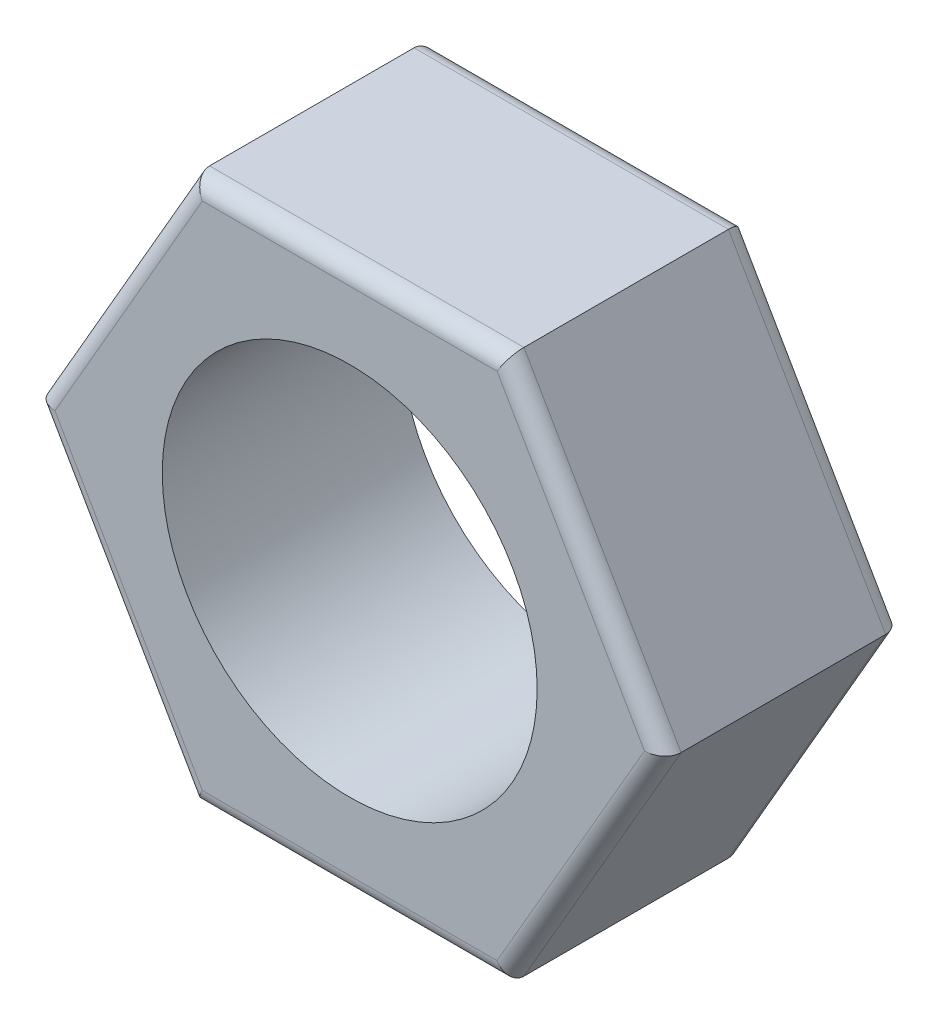
ISO-10303-21;
HEADER;
FILE_DESCRIPTION(('STEP AP214'),'2;1');
FILE_NAME('part.step','',(''),(''),'','','');
FILE_SCHEMA(('AUTOMOTIVE_DESIGN { 1 0 10303 214 1 1 1 1 }'));
ENDSEC;
DATA;
#1=APPLICATION_CONTEXT('core data for automotive mechanical design processes');
#2=APPLICATION_PROTOCOL_DEFINITION('international standard','automotive_design',2000,#1);
#3=PRODUCT_CONTEXT('',#1,'mechanical');
#4=PRODUCT('Part','Part','',(#3));
#5=PRODUCT_RELATED_PRODUCT_CATEGORY('part','',(#4));
#6=PRODUCT_DEFINITION_FORMATION('','',#4);
#7=PRODUCT_DEFINITION_CONTEXT('part definition',#1,'design');
#8=PRODUCT_DEFINITION('design','',#6,#7);
#9=PRODUCT_DEFINITION_SHAPE('','',#8);
#10=(LENGTH_UNIT() NAMED_UNIT(*) SI_UNIT(.MILLI.,.METRE.));
#11=(NAMED_UNIT(*) PLANE_ANGLE_UNIT() SI_UNIT($,.RADIAN.));
#12=(NAMED_UNIT(*) SI_UNIT($,.STERADIAN.) SOLID_ANGLE_UNIT());
#13=UNCERTAINTY_MEASURE_WITH_UNIT(LENGTH_MEASURE(1.E-05),#10,'distance_accuracy_value','');
#14=(GEOMETRIC_REPRESENTATION_CONTEXT(3) GLOBAL_UNCERTAINTY_ASSIGNED_CONTEXT((#13)) GLOBAL_UNIT_ASSIGNED_CONTEXT((#10,
#11,#12)) REPRESENTATION_CONTEXT('',''));
#15=CARTESIAN_POINT('',(0.,0.,0.));
#16=DIRECTION('',(0.,0.,1.));
#17=DIRECTION('',(1.,0.,0.));
#18=AXIS2_PLACEMENT_3D('',#15,#16,#17);
#19=CARTESIAN_POINT('',(-9.225,-15.9781686998229,14.));
#20=DIRECTION('',(0.,1.,0.));
#21=DIRECTION('',(0.,0.,1.));
#22=AXIS2_PLACEMENT_3D('',#19,#20,#21);
#23=PLANE('',#22);
#24=DIRECTION('',(0.,0.,-1.));
#25=VECTOR('',#24,1.);
#26=CARTESIAN_POINT('',(9.225,-15.9781686998229,14.));
#27=LINE('',#26,#25);
#28=CARTESIAN_POINT('',(9.225,-15.9781686998229,13.));
#29=VERTEX_POINT('',#28);
#30=CARTESIAN_POINT('',(9.225,-15.9781686998229,0.999999999999999));
#31=VERTEX_POINT('',#30);
#32=EDGE_CURVE('E149',#29,#31,#27,.T.);
#33=ORIENTED_EDGE('',*,*,#32,.F.);
#34=DIRECTION('',(1.,0.,0.));
#35=VECTOR('',#34,1.);
#36=CARTESIAN_POINT('',(-9.225,-15.9781686998229,13.));
#37=LINE('',#36,#35);
#38=CARTESIAN_POINT('',(-9.225,-15.9781686998229,13.));
#39=VERTEX_POINT('',#38);
#40=EDGE_CURVE('E209',#29,#39,#37,.F.);
#41=ORIENTED_EDGE('',*,*,#40,.T.);
#42=DIRECTION('',(0.,0.,-1.));
#43=VECTOR('',#42,1.);
#44=CARTESIAN_POINT('',(-9.225,-15.9781686998229,14.));
#45=LINE('',#44,#43);
#46=CARTESIAN_POINT('',(-9.225,-15.9781686998229,0.999999999999999));
#47=VERTEX_POINT('',#46);
#48=EDGE_CURVE('E260',#39,#47,#45,.T.);
#49=ORIENTED_EDGE('',*,*,#48,.T.);
#50=DIRECTION('',(1.,0.,0.));
#51=VECTOR('',#50,1.);
#52=CARTESIAN_POINT('',(-9.225,-15.9781686998229,0.999999999999999));
#53=LINE('',#52,#51);
#54=EDGE_CURVE('E207',#47,#31,#53,.T.);
#55=ORIENTED_EDGE('',*,*,#54,.T.);
#56=EDGE_LOOP('',(#33,#41,#49,#55));
#57=FACE_BOUND('',#56,.T.);
#58=ADVANCED_FACE('F36',(#57),#23,.F.);
#59=CARTESIAN_POINT('',(9.225,-15.9781686998229,14.));
#60=DIRECTION('',(-0.866025403784439,0.5,0.));
#61=DIRECTION('',(-0.5,-0.866025403784439,0.));
#62=AXIS2_PLACEMENT_3D('',#59,#60,#61);
#63=PLANE('',#62);
#64=DIRECTION('',(0.,0.,-1.));
#65=VECTOR('',#64,1.);
#66=CARTESIAN_POINT('',(18.45,0.,14.));
#67=LINE('',#66,#65);
#68=CARTESIAN_POINT('',(18.45,0.,13.));
#69=VERTEX_POINT('',#68);
#70=CARTESIAN_POINT('',(18.45,0.,0.999999999999999));
#71=VERTEX_POINT('',#70);
#72=EDGE_CURVE('E270',#69,#71,#67,.T.);
#73=ORIENTED_EDGE('',*,*,#72,.F.);
#74=DIRECTION('',(0.5,0.866025403784439,0.));
#75=VECTOR('',#74,1.);
#76=CARTESIAN_POINT('',(9.225,-15.9781686998229,13.));
#77=LINE('',#76,#75);
#78=EDGE_CURVE('E202',#69,#29,#77,.F.);
#79=ORIENTED_EDGE('',*,*,#78,.T.);
#80=ORIENTED_EDGE('',*,*,#32,.T.);
#81=DIRECTION('',(0.5,0.866025403784439,0.));
#82=VECTOR('',#81,1.);
#83=CARTESIAN_POINT('',(9.225,-15.9781686998229,0.999999999999999));
#84=LINE('',#83,#82);
#85=EDGE_CURVE('E232',#31,#71,#84,.T.);
#86=ORIENTED_EDGE('',*,*,#85,.T.);
#87=EDGE_LOOP('',(#73,#79,#80,#86));
#88=FACE_BOUND('',#87,.T.);
#89=ADVANCED_FACE('F282',(#88),#63,.F.);
#90=CARTESIAN_POINT('',(18.45,0.,14.));
#91=DIRECTION('',(-0.866025403784439,-0.5,0.));
#92=DIRECTION('',(0.5,-0.866025403784439,0.));
#93=AXIS2_PLACEMENT_3D('',#90,#91,#92);
#94=PLANE('',#93);
#95=DIRECTION('',(0.,0.,-1.));
#96=VECTOR('',#95,1.);
#97=CARTESIAN_POINT('',(9.22499999999999,15.9781686998229,14.));
#98=LINE('',#97,#96);
#99=CARTESIAN_POINT('',(9.22499999999999,15.9781686998229,13.));
#100=VERTEX_POINT('',#99);
#101=CARTESIAN_POINT('',(9.22499999999999,15.9781686998229,0.999999999999999));
#102=VERTEX_POINT('',#101);
#103=EDGE_CURVE('E262',#100,#102,#98,.T.);
#104=ORIENTED_EDGE('',*,*,#103,.F.);
#105=DIRECTION('',(-0.5,0.866025403784439,0.));
#106=VECTOR('',#105,1.);
#107=CARTESIAN_POINT('',(18.45,0.,13.));
#108=LINE('',#107,#106);
#109=EDGE_CURVE('E193',#100,#69,#108,.F.);
#110=ORIENTED_EDGE('',*,*,#109,.T.);
#111=ORIENTED_EDGE('',*,*,#72,.T.);
#112=DIRECTION('',(-0.5,0.866025403784439,0.));
#113=VECTOR('',#112,1.);
#114=CARTESIAN_POINT('',(18.45,0.,0.999999999999999));
#115=LINE('',#114,#113);
#116=EDGE_CURVE('E199',#71,#102,#115,.T.);
#117=ORIENTED_EDGE('',*,*,#116,.T.);
#118=EDGE_LOOP('',(#104,#110,#111,#117));
#119=FACE_BOUND('',#118,.T.);
#120=ADVANCED_FACE('F305',(#119),#94,.F.);
#121=CARTESIAN_POINT('',(9.22499999999999,15.9781686998229,14.));
#122=DIRECTION('',(0.,-1.,0.));
#123=DIRECTION('',(0.,0.,-1.));
#124=AXIS2_PLACEMENT_3D('',#121,#122,#123);
#125=PLANE('',#124);
#126=DIRECTION('',(0.,0.,-1.));
#127=VECTOR('',#126,1.);
#128=CARTESIAN_POINT('',(-9.225,15.9781686998229,14.));
#129=LINE('',#128,#127);
#130=CARTESIAN_POINT('',(-9.225,15.9781686998229,13.));
#131=VERTEX_POINT('',#130);
#132=CARTESIAN_POINT('',(-9.225,15.9781686998229,0.999999999999999));
#133=VERTEX_POINT('',#132);
#134=EDGE_CURVE('E254',#131,#133,#129,.T.);
#135=ORIENTED_EDGE('',*,*,#134,.F.);
#136=DIRECTION('',(-1.,0.,0.));
#137=VECTOR('',#136,1.);
#138=CARTESIAN_POINT('',(9.22499999999999,15.9781686998229,13.));
#139=LINE('',#138,#137);
#140=EDGE_CURVE('E152',#131,#100,#139,.F.);
#141=ORIENTED_EDGE('',*,*,#140,.T.);
#142=ORIENTED_EDGE('',*,*,#103,.T.);
#143=DIRECTION('',(-1.,0.,0.));
#144=VECTOR('',#143,1.);
#145=CARTESIAN_POINT('',(9.22499999999999,15.9781686998229,0.999999999999999));
#146=LINE('',#145,#144);
#147=EDGE_CURVE('E198',#102,#133,#146,.T.);
#148=ORIENTED_EDGE('',*,*,#147,.T.);
#149=EDGE_LOOP('',(#135,#141,#142,#148));
#150=FACE_BOUND('',#149,.T.);
#151=ADVANCED_FACE('F310',(#150),#125,.F.);
#152=CARTESIAN_POINT('',(-9.225,15.9781686998229,14.));
#153=DIRECTION('',(0.866025403784439,-0.5,0.));
#154=DIRECTION('',(0.5,0.866025403784439,0.));
#155=AXIS2_PLACEMENT_3D('',#152,#153,#154);
#156=PLANE('',#155);
#157=DIRECTION('',(0.,0.,-1.));
#158=VECTOR('',#157,1.);
#159=CARTESIAN_POINT('',(-18.45,0.,14.));
#160=LINE('',#159,#158);
#161=CARTESIAN_POINT('',(-18.45,0.,13.));
#162=VERTEX_POINT('',#161);
#163=CARTESIAN_POINT('',(-18.45,0.,0.999999999999999));
#164=VERTEX_POINT('',#163);
#165=EDGE_CURVE('E252',#162,#164,#160,.T.);
#166=ORIENTED_EDGE('',*,*,#165,.F.);
#167=DIRECTION('',(-0.5,-0.866025403784439,0.));
#168=VECTOR('',#167,1.);
#169=CARTESIAN_POINT('',(-9.22499999999999,15.9781686998229,13.));
#170=LINE('',#169,#168);
#171=EDGE_CURVE('E218',#162,#131,#170,.F.);
#172=ORIENTED_EDGE('',*,*,#171,.T.);
#173=ORIENTED_EDGE('',*,*,#134,.T.);
#174=DIRECTION('',(-0.5,-0.866025403784439,0.));
#175=VECTOR('',#174,1.);
#176=CARTESIAN_POINT('',(-9.225,15.9781686998229,0.999999999999999));
#177=LINE('',#176,#175);
#178=EDGE_CURVE('E216',#133,#164,#177,.T.);
#179=ORIENTED_EDGE('',*,*,#178,.T.);
#180=EDGE_LOOP('',(#166,#172,#173,#179));
#181=FACE_BOUND('',#180,.T.);
#182=ADVANCED_FACE('F251',(#181),#156,.F.);
#183=CARTESIAN_POINT('',(-18.45,0.,14.));
#184=DIRECTION('',(0.866025403784439,0.5,0.));
#185=DIRECTION('',(-0.5,0.866025403784439,0.));
#186=AXIS2_PLACEMENT_3D('',#183,#184,#185);
#187=PLANE('',#186);
#188=ORIENTED_EDGE('',*,*,#48,.F.);
#189=DIRECTION('',(0.5,-0.866025403784439,0.));
#190=VECTOR('',#189,1.);
#191=CARTESIAN_POINT('',(-18.45,0.,13.));
#192=LINE('',#191,#190);
#193=EDGE_CURVE('E214',#39,#162,#192,.F.);
#194=ORIENTED_EDGE('',*,*,#193,.T.);
#195=ORIENTED_EDGE('',*,*,#165,.T.);
#196=DIRECTION('',(0.5,-0.866025403784439,0.));
#197=VECTOR('',#196,1.);
#198=CARTESIAN_POINT('',(-18.45,0.,0.999999999999999));
#199=LINE('',#198,#197);
#200=EDGE_CURVE('E211',#164,#47,#199,.T.);
#201=ORIENTED_EDGE('',*,*,#200,.T.);
#202=EDGE_LOOP('',(#188,#194,#195,#201));
#203=FACE_BOUND('',#202,.T.);
#204=ADVANCED_FACE('F257',(#203),#187,.F.);
#205=CARTESIAN_POINT('',(9.225,-15.9781686998229,14.));
#206=DIRECTION('',(0.,0.,1.));
#207=DIRECTION('',(1.,0.,0.));
#208=AXIS2_PLACEMENT_3D('',#205,#206,#207);
#209=PLANE('',#208);
#210=DIRECTION('',(1.,0.,0.));
#211=VECTOR('',#210,1.);
#212=CARTESIAN_POINT('',(9.225,-14.9781686998229,14.));
#213=LINE('',#212,#211);
#214=CARTESIAN_POINT('',(-8.64764973081037,-14.9781686998229,14.));
#215=VERTEX_POINT('',#214);
#216=CARTESIAN_POINT('',(8.64764973081037,-14.9781686998229,14.));
#217=VERTEX_POINT('',#216);
#218=EDGE_CURVE('E137',#215,#217,#213,.T.);
#219=ORIENTED_EDGE('',*,*,#218,.T.);
#220=DIRECTION('',(0.5,0.866025403784439,0.));
#221=VECTOR('',#220,1.);
#222=CARTESIAN_POINT('',(17.5839745962156,0.5,14.));
#223=LINE('',#222,#221);
#224=CARTESIAN_POINT('',(17.2952994616207,0.,14.));
#225=VERTEX_POINT('',#224);
#226=EDGE_CURVE('E277',#217,#225,#223,.T.);
#227=ORIENTED_EDGE('',*,*,#226,.T.);
#228=DIRECTION('',(-0.5,0.866025403784439,0.));
#229=VECTOR('',#228,1.);
#230=CARTESIAN_POINT('',(8.35897459621555,15.4781686998229,14.));
#231=LINE('',#230,#229);
#232=CARTESIAN_POINT('',(8.64764973081037,14.9781686998229,14.));
#233=VERTEX_POINT('',#232);
#234=EDGE_CURVE('E132',#225,#233,#231,.T.);
#235=ORIENTED_EDGE('',*,*,#234,.T.);
#236=DIRECTION('',(-1.,0.,0.));
#237=VECTOR('',#236,1.);
#238=CARTESIAN_POINT('',(-9.225,14.9781686998229,14.));
#239=LINE('',#238,#237);
#240=CARTESIAN_POINT('',(-8.64764973081037,14.9781686998229,14.));
#241=VERTEX_POINT('',#240);
#242=EDGE_CURVE('E124',#233,#241,#239,.T.);
#243=ORIENTED_EDGE('',*,*,#242,.T.);
#244=DIRECTION('',(-0.5,-0.866025403784439,0.));
#245=VECTOR('',#244,1.);
#246=CARTESIAN_POINT('',(-17.5839745962156,-0.499999999999996,14.));
#247=LINE('',#246,#245);
#248=CARTESIAN_POINT('',(-17.2952994616207,0.,14.));
#249=VERTEX_POINT('',#248);
#250=EDGE_CURVE('E128',#241,#249,#247,.T.);
#251=ORIENTED_EDGE('',*,*,#250,.T.);
#252=DIRECTION('',(0.5,-0.866025403784439,0.));
#253=VECTOR('',#252,1.);
#254=CARTESIAN_POINT('',(-8.35897459621556,-15.4781686998229,14.));
#255=LINE('',#254,#253);
#256=EDGE_CURVE('E148',#249,#215,#255,.T.);
#257=ORIENTED_EDGE('',*,*,#256,.T.);
#258=EDGE_LOOP('',(#219,#227,#235,#243,#251,#257));
#259=FACE_BOUND('',#258,.T.);
#260=CARTESIAN_POINT('',(0.,0.,14.));
#261=DIRECTION('',(0.,0.,-1.));
#262=DIRECTION('',(-1.,0.,0.));
#263=AXIS2_PLACEMENT_3D('',#260,#261,#262);
#264=CIRCLE('',#263,11.);
#265=CARTESIAN_POINT('',(-11.,0.,14.));
#266=VERTEX_POINT('',#265);
#267=EDGE_CURVE('E264',#266,#266,#264,.T.);
#268=ORIENTED_EDGE('',*,*,#267,.T.);
#269=EDGE_LOOP('',(#268));
#270=FACE_BOUND('',#269,.T.);
#271=ADVANCED_FACE('F126',(#259,#270),#209,.T.);
#272=CARTESIAN_POINT('',(9.225,-15.9781686998229,0.));
#273=DIRECTION('',(0.,0.,1.));
#274=DIRECTION('',(1.,0.,0.));
#275=AXIS2_PLACEMENT_3D('',#272,#273,#274);
#276=PLANE('',#275);
#277=DIRECTION('',(1.,0.,0.));
#278=VECTOR('',#277,1.);
#279=CARTESIAN_POINT('',(9.225,-14.9781686998229,0.));
#280=LINE('',#279,#278);
#281=CARTESIAN_POINT('',(8.64764973081037,-14.9781686998229,0.));
#282=VERTEX_POINT('',#281);
#283=CARTESIAN_POINT('',(-8.64764973081037,-14.9781686998229,0.));
#284=VERTEX_POINT('',#283);
#285=EDGE_CURVE('E45',#282,#284,#280,.F.);
#286=ORIENTED_EDGE('',*,*,#285,.T.);
#287=DIRECTION('',(0.5,-0.866025403784439,0.));
#288=VECTOR('',#287,1.);
#289=CARTESIAN_POINT('',(-3.74647459621556,-23.4672530497343,0.));
#290=LINE('',#289,#288);
#291=CARTESIAN_POINT('',(-17.2952994616207,0.,0.));
#292=VERTEX_POINT('',#291);
#293=EDGE_CURVE('E11',#284,#292,#290,.F.);
#294=ORIENTED_EDGE('',*,*,#293,.T.);
#295=DIRECTION('',(-0.5,-0.866025403784439,0.));
#296=VECTOR('',#295,1.);
#297=CARTESIAN_POINT('',(-17.5839745962156,-0.499999999999997,0.));
#298=LINE('',#297,#296);
#299=CARTESIAN_POINT('',(-8.64764973081037,14.9781686998229,0.));
#300=VERTEX_POINT('',#299);
#301=EDGE_CURVE('E220',#292,#300,#298,.F.);
#302=ORIENTED_EDGE('',*,*,#301,.T.);
#303=DIRECTION('',(-1.,0.,0.));
#304=VECTOR('',#303,1.);
#305=CARTESIAN_POINT('',(9.225,14.9781686998229,0.));
#306=LINE('',#305,#304);
#307=CARTESIAN_POINT('',(8.64764973081037,14.9781686998229,0.));
#308=VERTEX_POINT('',#307);
#309=EDGE_CURVE('E222',#300,#308,#306,.F.);
#310=ORIENTED_EDGE('',*,*,#309,.T.);
#311=DIRECTION('',(-0.5,0.866025403784439,0.));
#312=VECTOR('',#311,1.);
#313=CARTESIAN_POINT('',(22.1964745962156,-8.48908434991144,0.));
#314=LINE('',#313,#312);
#315=CARTESIAN_POINT('',(17.2952994616207,0.,0.));
#316=VERTEX_POINT('',#315);
#317=EDGE_CURVE('E224',#308,#316,#314,.F.);
#318=ORIENTED_EDGE('',*,*,#317,.T.);
#319=DIRECTION('',(0.5,0.866025403784439,0.));
#320=VECTOR('',#319,1.);
#321=CARTESIAN_POINT('',(8.35897459621556,-15.4781686998229,0.));
#322=LINE('',#321,#320);
#323=EDGE_CURVE('E56',#316,#282,#322,.F.);
#324=ORIENTED_EDGE('',*,*,#323,.T.);
#325=EDGE_LOOP('',(#286,#294,#302,#310,#318,#324));
#326=FACE_BOUND('',#325,.T.);
#327=CARTESIAN_POINT('',(0.,0.,0.));
#328=DIRECTION('',(0.,0.,-1.));
#329=DIRECTION('',(-1.,0.,0.));
#330=AXIS2_PLACEMENT_3D('',#327,#328,#329);
#331=CIRCLE('',#330,11.);
#332=CARTESIAN_POINT('',(-11.,0.,0.));
#333=VERTEX_POINT('',#332);
#334=EDGE_CURVE('E155',#333,#333,#331,.T.);
#335=ORIENTED_EDGE('',*,*,#334,.F.);
#336=EDGE_LOOP('',(#335));
#337=FACE_BOUND('',#336,.T.);
#338=ADVANCED_FACE('F227',(#326,#337),#276,.F.);
#339=CARTESIAN_POINT('',(0.,0.,14.));
#340=DIRECTION('',(0.,0.,-1.));
#341=DIRECTION('',(-1.,0.,0.));
#342=AXIS2_PLACEMENT_3D('',#339,#340,#341);
#343=CYLINDRICAL_SURFACE('',#342,11.);
#344=ORIENTED_EDGE('',*,*,#267,.F.);
#345=EDGE_LOOP('',(#344));
#346=FACE_BOUND('',#345,.T.);
#347=ORIENTED_EDGE('',*,*,#334,.T.);
#348=EDGE_LOOP('',(#347));
#349=FACE_BOUND('',#348,.T.);
#350=ADVANCED_FACE('F320',(#346,#349),#343,.F.);
#351=CARTESIAN_POINT('',(-17.5839745962156,-0.499999999999997,13.));
#352=DIRECTION('',(0.5,0.866025403784439,0.));
#353=DIRECTION('',(-0.866025403784439,0.5,0.));
#354=AXIS2_PLACEMENT_3D('',#351,#352,#353);
#355=CYLINDRICAL_SURFACE('',#354,1.);
#356=CARTESIAN_POINT('',(-8.64764973081037,14.9781686998229,13.));
#357=DIRECTION('',(0.866025403784439,0.5,0.));
#358=DIRECTION('',(-0.5,0.866025403784439,0.));
#359=AXIS2_PLACEMENT_3D('',#356,#357,#358);
#360=ELLIPSE('',#359,1.15470053837925,1.);
#361=EDGE_CURVE('E143',#131,#241,#360,.T.);
#362=ORIENTED_EDGE('',*,*,#361,.F.);
#363=ORIENTED_EDGE('',*,*,#171,.F.);
#364=CARTESIAN_POINT('',(-17.2952994616207,0.,13.));
#365=DIRECTION('',(0.,1.,0.));
#366=DIRECTION('',(1.,0.,0.));
#367=AXIS2_PLACEMENT_3D('',#364,#365,#366);
#368=ELLIPSE('',#367,1.15470053837925,1.);
#369=EDGE_CURVE('E146',#249,#162,#368,.F.);
#370=ORIENTED_EDGE('',*,*,#369,.F.);
#371=ORIENTED_EDGE('',*,*,#250,.F.);
#372=EDGE_LOOP('',(#362,#363,#370,#371));
#373=FACE_BOUND('',#372,.T.);
#374=ADVANCED_FACE('F141',(#373),#355,.T.);
#375=CARTESIAN_POINT('',(-3.74647459621556,-23.4672530497343,13.));
#376=DIRECTION('',(-0.5,0.866025403784439,0.));
#377=DIRECTION('',(-0.866025403784439,-0.5,0.));
#378=AXIS2_PLACEMENT_3D('',#375,#376,#377);
#379=CYLINDRICAL_SURFACE('',#378,1.);
#380=ORIENTED_EDGE('',*,*,#369,.T.);
#381=ORIENTED_EDGE('',*,*,#193,.F.);
#382=CARTESIAN_POINT('',(-8.64764973081037,-14.9781686998229,13.));
#383=DIRECTION('',(-0.866025403784439,0.5,0.));
#384=DIRECTION('',(0.5,0.866025403784439,0.));
#385=AXIS2_PLACEMENT_3D('',#382,#383,#384);
#386=ELLIPSE('',#385,1.15470053837925,1.);
#387=EDGE_CURVE('E153',#215,#39,#386,.F.);
#388=ORIENTED_EDGE('',*,*,#387,.F.);
#389=ORIENTED_EDGE('',*,*,#256,.F.);
#390=EDGE_LOOP('',(#380,#381,#388,#389));
#391=FACE_BOUND('',#390,.T.);
#392=ADVANCED_FACE('F287',(#391),#379,.T.);
#393=CARTESIAN_POINT('',(9.225,14.9781686998229,13.));
#394=DIRECTION('',(1.,0.,0.));
#395=DIRECTION('',(0.,0.,-1.));
#396=AXIS2_PLACEMENT_3D('',#393,#394,#395);
#397=CYLINDRICAL_SURFACE('',#396,1.);
#398=ORIENTED_EDGE('',*,*,#361,.T.);
#399=ORIENTED_EDGE('',*,*,#242,.F.);
#400=CARTESIAN_POINT('',(8.64764973081036,14.9781686998229,13.));
#401=DIRECTION('',(0.866025403784439,-0.5,0.));
#402=DIRECTION('',(0.5,0.866025403784439,0.));
#403=AXIS2_PLACEMENT_3D('',#400,#401,#402);
#404=ELLIPSE('',#403,1.15470053837925,1.);
#405=EDGE_CURVE('E158',#100,#233,#404,.T.);
#406=ORIENTED_EDGE('',*,*,#405,.F.);
#407=ORIENTED_EDGE('',*,*,#140,.F.);
#408=EDGE_LOOP('',(#398,#399,#406,#407));
#409=FACE_BOUND('',#408,.T.);
#410=ADVANCED_FACE('F151',(#409),#397,.T.);
#411=CARTESIAN_POINT('',(9.225,-14.9781686998229,13.));
#412=DIRECTION('',(-1.,0.,0.));
#413=DIRECTION('',(0.,0.,1.));
#414=AXIS2_PLACEMENT_3D('',#411,#412,#413);
#415=CYLINDRICAL_SURFACE('',#414,1.);
#416=ORIENTED_EDGE('',*,*,#387,.T.);
#417=ORIENTED_EDGE('',*,*,#40,.F.);
#418=CARTESIAN_POINT('',(8.64764973081037,-14.9781686998229,13.));
#419=DIRECTION('',(-0.866025403784439,-0.5,0.));
#420=DIRECTION('',(-0.5,0.866025403784439,0.));
#421=AXIS2_PLACEMENT_3D('',#418,#419,#420);
#422=ELLIPSE('',#421,1.15470053837925,1.);
#423=EDGE_CURVE('E182',#217,#29,#422,.F.);
#424=ORIENTED_EDGE('',*,*,#423,.F.);
#425=ORIENTED_EDGE('',*,*,#218,.F.);
#426=EDGE_LOOP('',(#416,#417,#424,#425));
#427=FACE_BOUND('',#426,.T.);
#428=ADVANCED_FACE('F290',(#427),#415,.T.);
#429=CARTESIAN_POINT('',(22.1964745962156,-8.48908434991144,13.));
#430=DIRECTION('',(0.5,-0.866025403784439,0.));
#431=DIRECTION('',(0.866025403784439,0.5,0.));
#432=AXIS2_PLACEMENT_3D('',#429,#430,#431);
#433=CYLINDRICAL_SURFACE('',#432,1.);
#434=ORIENTED_EDGE('',*,*,#405,.T.);
#435=ORIENTED_EDGE('',*,*,#234,.F.);
#436=CARTESIAN_POINT('',(17.2952994616207,0.,13.));
#437=DIRECTION('',(0.,-1.,0.));
#438=DIRECTION('',(1.,0.,0.));
#439=AXIS2_PLACEMENT_3D('',#436,#437,#438);
#440=ELLIPSE('',#439,1.15470053837925,1.);
#441=EDGE_CURVE('E177',#69,#225,#440,.T.);
#442=ORIENTED_EDGE('',*,*,#441,.F.);
#443=ORIENTED_EDGE('',*,*,#109,.F.);
#444=EDGE_LOOP('',(#434,#435,#442,#443));
#445=FACE_BOUND('',#444,.T.);
#446=ADVANCED_FACE('F192',(#445),#433,.T.);
#447=CARTESIAN_POINT('',(8.35897459621556,-15.4781686998229,13.));
#448=DIRECTION('',(-0.5,-0.866025403784439,0.));
#449=DIRECTION('',(0.866025403784439,-0.5,0.));
#450=AXIS2_PLACEMENT_3D('',#447,#448,#449);
#451=CYLINDRICAL_SURFACE('',#450,1.);
#452=ORIENTED_EDGE('',*,*,#423,.T.);
#453=ORIENTED_EDGE('',*,*,#78,.F.);
#454=ORIENTED_EDGE('',*,*,#441,.T.);
#455=ORIENTED_EDGE('',*,*,#226,.F.);
#456=EDGE_LOOP('',(#452,#453,#454,#455));
#457=FACE_BOUND('',#456,.T.);
#458=ADVANCED_FACE('F292',(#457),#451,.T.);
#459=CARTESIAN_POINT('',(17.5839745962156,-0.500000000000002,0.999999999999999));
#460=DIRECTION('',(-0.5,0.866025403784439,0.));
#461=DIRECTION('',(-0.866025403784439,-0.5,0.));
#462=AXIS2_PLACEMENT_3D('',#459,#460,#461);
#463=CYLINDRICAL_SURFACE('',#462,1.);
#464=CARTESIAN_POINT('',(17.2952994616207,0.,0.999999999999999));
#465=DIRECTION('',(0.,1.,0.));
#466=DIRECTION('',(-1.,0.,0.));
#467=AXIS2_PLACEMENT_3D('',#464,#465,#466);
#468=ELLIPSE('',#467,1.15470053837925,1.);
#469=EDGE_CURVE('E171',#316,#71,#468,.F.);
#470=ORIENTED_EDGE('',*,*,#469,.F.);
#471=ORIENTED_EDGE('',*,*,#317,.F.);
#472=CARTESIAN_POINT('',(8.64764973081037,14.9781686998229,0.999999999999999));
#473=DIRECTION('',(-0.866025403784439,0.5,0.));
#474=DIRECTION('',(-0.5,-0.866025403784439,0.));
#475=AXIS2_PLACEMENT_3D('',#472,#473,#474);
#476=ELLIPSE('',#475,1.15470053837925,1.);
#477=EDGE_CURVE('E40',#102,#308,#476,.T.);
#478=ORIENTED_EDGE('',*,*,#477,.F.);
#479=ORIENTED_EDGE('',*,*,#116,.F.);
#480=EDGE_LOOP('',(#470,#471,#478,#479));
#481=FACE_BOUND('',#480,.T.);
#482=ADVANCED_FACE('F38',(#481),#463,.T.);
#483=CARTESIAN_POINT('',(9.22499999999999,14.9781686998229,0.999999999999999));
#484=DIRECTION('',(-1.,0.,0.));
#485=DIRECTION('',(0.,0.,1.));
#486=AXIS2_PLACEMENT_3D('',#483,#484,#485);
#487=CYLINDRICAL_SURFACE('',#486,1.);
#488=ORIENTED_EDGE('',*,*,#477,.T.);
#489=ORIENTED_EDGE('',*,*,#309,.F.);
#490=CARTESIAN_POINT('',(-8.64764973081037,14.9781686998229,0.999999999999999));
#491=DIRECTION('',(-0.866025403784439,-0.5,0.));
#492=DIRECTION('',(0.5,-0.866025403784439,0.));
#493=AXIS2_PLACEMENT_3D('',#490,#491,#492);
#494=ELLIPSE('',#493,1.15470053837925,1.);
#495=EDGE_CURVE('E169',#133,#300,#494,.T.);
#496=ORIENTED_EDGE('',*,*,#495,.F.);
#497=ORIENTED_EDGE('',*,*,#147,.F.);
#498=EDGE_LOOP('',(#488,#489,#496,#497));
#499=FACE_BOUND('',#498,.T.);
#500=ADVANCED_FACE('F244',(#499),#487,.T.);
#501=CARTESIAN_POINT('',(8.35897459621556,-15.4781686998229,0.999999999999999));
#502=DIRECTION('',(0.5,0.866025403784439,0.));
#503=DIRECTION('',(-0.866025403784439,0.5,0.));
#504=AXIS2_PLACEMENT_3D('',#501,#502,#503);
#505=CYLINDRICAL_SURFACE('',#504,1.);
#506=ORIENTED_EDGE('',*,*,#469,.T.);
#507=ORIENTED_EDGE('',*,*,#85,.F.);
#508=CARTESIAN_POINT('',(8.64764973081037,-14.9781686998229,0.999999999999999));
#509=DIRECTION('',(0.866025403784439,0.5,0.));
#510=DIRECTION('',(-0.5,0.866025403784439,0.));
#511=AXIS2_PLACEMENT_3D('',#508,#509,#510);
#512=ELLIPSE('',#511,1.15470053837925,1.);
#513=EDGE_CURVE('E166',#282,#31,#512,.F.);
#514=ORIENTED_EDGE('',*,*,#513,.F.);
#515=ORIENTED_EDGE('',*,*,#323,.F.);
#516=EDGE_LOOP('',(#506,#507,#514,#515));
#517=FACE_BOUND('',#516,.T.);
#518=ADVANCED_FACE('F231',(#517),#505,.T.);
#519=CARTESIAN_POINT('',(-8.35897459621556,15.4781686998229,0.999999999999999));
#520=DIRECTION('',(-0.5,-0.866025403784439,0.));
#521=DIRECTION('',(0.866025403784439,-0.5,0.));
#522=AXIS2_PLACEMENT_3D('',#519,#520,#521);
#523=CYLINDRICAL_SURFACE('',#522,1.);
#524=ORIENTED_EDGE('',*,*,#495,.T.);
#525=ORIENTED_EDGE('',*,*,#301,.F.);
#526=CARTESIAN_POINT('',(-17.2952994616207,0.,0.999999999999999));
#527=DIRECTION('',(0.,-1.,0.));
#528=DIRECTION('',(-1.,0.,0.));
#529=AXIS2_PLACEMENT_3D('',#526,#527,#528);
#530=ELLIPSE('',#529,1.15470053837925,1.);
#531=EDGE_CURVE('E164',#164,#292,#530,.T.);
#532=ORIENTED_EDGE('',*,*,#531,.F.);
#533=ORIENTED_EDGE('',*,*,#178,.F.);
#534=EDGE_LOOP('',(#524,#525,#532,#533));
#535=FACE_BOUND('',#534,.T.);
#536=ADVANCED_FACE('F246',(#535),#523,.T.);
#537=CARTESIAN_POINT('',(-9.225,-14.9781686998229,0.999999999999999));
#538=DIRECTION('',(1.,0.,0.));
#539=DIRECTION('',(0.,0.,-1.));
#540=AXIS2_PLACEMENT_3D('',#537,#538,#539);
#541=CYLINDRICAL_SURFACE('',#540,1.);
#542=ORIENTED_EDGE('',*,*,#513,.T.);
#543=ORIENTED_EDGE('',*,*,#54,.F.);
#544=CARTESIAN_POINT('',(-8.64764973081037,-14.9781686998229,0.999999999999999));
#545=DIRECTION('',(0.866025403784439,-0.5,0.));
#546=DIRECTION('',(0.5,0.866025403784439,0.));
#547=AXIS2_PLACEMENT_3D('',#544,#545,#546);
#548=ELLIPSE('',#547,1.15470053837925,1.);
#549=EDGE_CURVE('E162',#284,#47,#548,.F.);
#550=ORIENTED_EDGE('',*,*,#549,.F.);
#551=ORIENTED_EDGE('',*,*,#285,.F.);
#552=EDGE_LOOP('',(#542,#543,#550,#551));
#553=FACE_BOUND('',#552,.T.);
#554=ADVANCED_FACE('F236',(#553),#541,.T.);
#555=CARTESIAN_POINT('',(-17.5839745962156,0.500000000000004,0.999999999999999));
#556=DIRECTION('',(0.5,-0.866025403784439,0.));
#557=DIRECTION('',(0.866025403784439,0.5,0.));
#558=AXIS2_PLACEMENT_3D('',#555,#556,#557);
#559=CYLINDRICAL_SURFACE('',#558,1.);
#560=ORIENTED_EDGE('',*,*,#531,.T.);
#561=ORIENTED_EDGE('',*,*,#293,.F.);
#562=ORIENTED_EDGE('',*,*,#549,.T.);
#563=ORIENTED_EDGE('',*,*,#200,.F.);
#564=EDGE_LOOP('',(#560,#561,#562,#563));
#565=FACE_BOUND('',#564,.T.);
#566=ADVANCED_FACE('F239',(#565),#559,.T.);
#567=CLOSED_SHELL('',(#58,#89,#120,#151,#182,#204,#271,#338,#350,#374,#392,#410,#428,#446,#458,
#482,#500,#518,#536,#554,#566));
#568=MANIFOLD_SOLID_BREP('B2',#567);
#569=ADVANCED_BREP_SHAPE_REPRESENTATION('',(#18,#568),#14);
#570=SHAPE_DEFINITION_REPRESENTATION(#9,#569);
ENDSEC;
END-ISO-10303-21;
